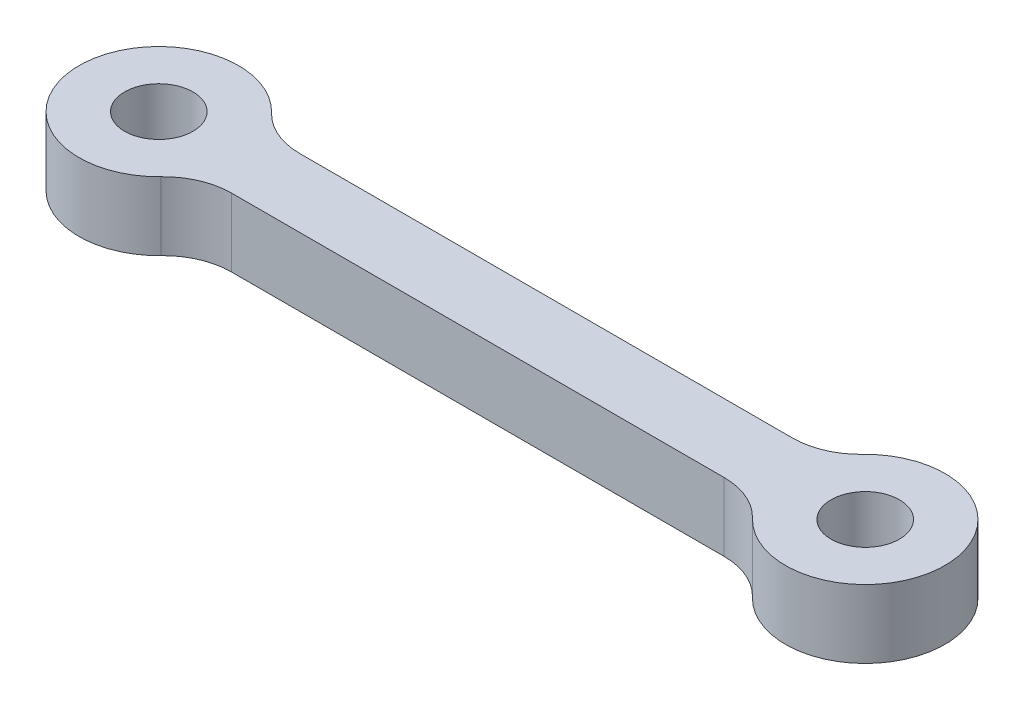
ISO-10303-21;
HEADER;
FILE_DESCRIPTION(('STEP AP214'),'2;1');
FILE_NAME('part.step','',(''),(''),'','','');
FILE_SCHEMA(('AUTOMOTIVE_DESIGN { 1 0 10303 214 1 1 1 1 }'));
ENDSEC;
DATA;
#1=APPLICATION_CONTEXT('core data for automotive mechanical design processes');
#2=APPLICATION_PROTOCOL_DEFINITION('international standard','automotive_design',2000,#1);
#3=PRODUCT_CONTEXT('',#1,'mechanical');
#4=PRODUCT('Part','Part','',(#3));
#5=PRODUCT_RELATED_PRODUCT_CATEGORY('part','',(#4));
#6=PRODUCT_DEFINITION_FORMATION('','',#4);
#7=PRODUCT_DEFINITION_CONTEXT('part definition',#1,'design');
#8=PRODUCT_DEFINITION('design','',#6,#7);
#9=PRODUCT_DEFINITION_SHAPE('','',#8);
#10=(LENGTH_UNIT() NAMED_UNIT(*) SI_UNIT(.MILLI.,.METRE.));
#11=(NAMED_UNIT(*) PLANE_ANGLE_UNIT() SI_UNIT($,.RADIAN.));
#12=(NAMED_UNIT(*) SI_UNIT($,.STERADIAN.) SOLID_ANGLE_UNIT());
#13=UNCERTAINTY_MEASURE_WITH_UNIT(LENGTH_MEASURE(1.E-05),#10,'distance_accuracy_value','');
#14=(GEOMETRIC_REPRESENTATION_CONTEXT(3) GLOBAL_UNCERTAINTY_ASSIGNED_CONTEXT((#13)) GLOBAL_UNIT_ASSIGNED_CONTEXT((#10,
#11,#12)) REPRESENTATION_CONTEXT('',''));
#15=CARTESIAN_POINT('',(0.,0.,0.));
#16=DIRECTION('',(0.,0.,1.));
#17=DIRECTION('',(1.,0.,0.));
#18=AXIS2_PLACEMENT_3D('',#15,#16,#17);
#19=CARTESIAN_POINT('',(29.2777777777778,2.83333333333333,0.));
#20=DIRECTION('',(0.,-1.,0.));
#21=DIRECTION('',(0.,0.,-1.));
#22=AXIS2_PLACEMENT_3D('',#19,#20,#21);
#23=CYLINDRICAL_SURFACE('',#22,3.11111111111111);
#24=CARTESIAN_POINT('',(29.2777777777778,2.83333333333333,0.));
#25=DIRECTION('',(0.,1.,0.));
#26=DIRECTION('',(0.,0.,1.));
#27=AXIS2_PLACEMENT_3D('',#24,#25,#26);
#28=CIRCLE('',#27,3.11111111111111);
#29=CARTESIAN_POINT('',(27.0327924568366,2.83333333333333,2.15384615384615));
#30=VERTEX_POINT('',#29);
#31=CARTESIAN_POINT('',(27.0327924568367,2.83333333333333,-2.15384615384616));
#32=VERTEX_POINT('',#31);
#33=EDGE_CURVE('E146',#30,#32,#28,.T.);
#34=ORIENTED_EDGE('',*,*,#33,.F.);
#35=DIRECTION('',(0.,-1.,0.));
#36=VECTOR('',#35,1.);
#37=CARTESIAN_POINT('',(27.0327924568366,2.83333333333333,2.15384615384615));
#38=LINE('',#37,#36);
#39=CARTESIAN_POINT('',(27.0327924568366,0.166666666666667,2.15384615384615));
#40=VERTEX_POINT('',#39);
#41=EDGE_CURVE('E154',#30,#40,#38,.T.);
#42=ORIENTED_EDGE('',*,*,#41,.T.);
#43=CARTESIAN_POINT('',(29.2777777777778,0.166666666666667,0.));
#44=DIRECTION('',(0.,1.,0.));
#45=DIRECTION('',(0.,0.,1.));
#46=AXIS2_PLACEMENT_3D('',#43,#44,#45);
#47=CIRCLE('',#46,3.11111111111111);
#48=CARTESIAN_POINT('',(27.0327924568367,0.166666666666667,-2.15384615384616));
#49=VERTEX_POINT('',#48);
#50=EDGE_CURVE('E171',#40,#49,#47,.T.);
#51=ORIENTED_EDGE('',*,*,#50,.T.);
#52=DIRECTION('',(0.,-1.,0.));
#53=VECTOR('',#52,1.);
#54=CARTESIAN_POINT('',(27.0327924568367,2.83333333333333,-2.15384615384615));
#55=LINE('',#54,#53);
#56=EDGE_CURVE('E152',#49,#32,#55,.F.);
#57=ORIENTED_EDGE('',*,*,#56,.T.);
#58=EDGE_LOOP('',(#34,#42,#51,#57));
#59=FACE_BOUND('',#58,.T.);
#60=ADVANCED_FACE('F40',(#59),#23,.T.);
#61=CARTESIAN_POINT('',(1.72222222222222,2.83333333333333,-1.33333333333333));
#62=DIRECTION('',(0.,0.,-1.));
#63=DIRECTION('',(-1.,0.,0.));
#64=AXIS2_PLACEMENT_3D('',#61,#62,#63);
#65=PLANE('',#64);
#66=DIRECTION('',(1.,0.,0.));
#67=VECTOR('',#66,1.);
#68=CARTESIAN_POINT('',(1.72222222222222,2.83333333333333,-1.33333333333333));
#69=LINE('',#68,#67);
#70=CARTESIAN_POINT('',(5.8914806753986,2.83333333333333,-1.33333333333333));
#71=VERTEX_POINT('',#70);
#72=CARTESIAN_POINT('',(25.1085193246014,2.83333333333333,-1.33333333333333));
#73=VERTEX_POINT('',#72);
#74=EDGE_CURVE('E178',#71,#73,#69,.T.);
#75=ORIENTED_EDGE('',*,*,#74,.T.);
#76=DIRECTION('',(0.,-1.,0.));
#77=VECTOR('',#76,1.);
#78=CARTESIAN_POINT('',(25.1085193246014,2.83333333333333,-1.33333333333333));
#79=LINE('',#78,#77);
#80=CARTESIAN_POINT('',(25.1085193246014,0.166666666666667,-1.33333333333333));
#81=VERTEX_POINT('',#80);
#82=EDGE_CURVE('E117',#73,#81,#79,.T.);
#83=ORIENTED_EDGE('',*,*,#82,.T.);
#84=DIRECTION('',(1.,0.,0.));
#85=VECTOR('',#84,1.);
#86=CARTESIAN_POINT('',(1.72222222222222,0.166666666666667,-1.33333333333333));
#87=LINE('',#86,#85);
#88=CARTESIAN_POINT('',(5.8914806753986,0.166666666666667,-1.33333333333333));
#89=VERTEX_POINT('',#88);
#90=EDGE_CURVE('E140',#89,#81,#87,.T.);
#91=ORIENTED_EDGE('',*,*,#90,.F.);
#92=DIRECTION('',(0.,-1.,0.));
#93=VECTOR('',#92,1.);
#94=CARTESIAN_POINT('',(5.8914806753986,2.83333333333333,-1.33333333333333));
#95=LINE('',#94,#93);
#96=EDGE_CURVE('E62',#89,#71,#95,.F.);
#97=ORIENTED_EDGE('',*,*,#96,.T.);
#98=EDGE_LOOP('',(#75,#83,#91,#97));
#99=FACE_BOUND('',#98,.T.);
#100=ADVANCED_FACE('F169',(#99),#65,.T.);
#101=CARTESIAN_POINT('',(1.72222222222222,2.83333333333333,0.));
#102=DIRECTION('',(0.,-1.,0.));
#103=DIRECTION('',(0.,0.,-1.));
#104=AXIS2_PLACEMENT_3D('',#101,#102,#103);
#105=CYLINDRICAL_SURFACE('',#104,3.11111111111111);
#106=CARTESIAN_POINT('',(1.72222222222222,0.166666666666667,0.));
#107=DIRECTION('',(0.,1.,0.));
#108=DIRECTION('',(0.,0.,1.));
#109=AXIS2_PLACEMENT_3D('',#106,#107,#108);
#110=CIRCLE('',#109,3.11111111111111);
#111=CARTESIAN_POINT('',(3.96720754316335,0.166666666666667,-2.15384615384615));
#112=VERTEX_POINT('',#111);
#113=CARTESIAN_POINT('',(3.96720754316335,0.166666666666667,2.15384615384615));
#114=VERTEX_POINT('',#113);
#115=EDGE_CURVE('E135',#112,#114,#110,.T.);
#116=ORIENTED_EDGE('',*,*,#115,.T.);
#117=DIRECTION('',(0.,-1.,0.));
#118=VECTOR('',#117,1.);
#119=CARTESIAN_POINT('',(3.96720754316335,2.83333333333333,2.15384615384615));
#120=LINE('',#119,#118);
#121=CARTESIAN_POINT('',(3.96720754316335,2.83333333333333,2.15384615384615));
#122=VERTEX_POINT('',#121);
#123=EDGE_CURVE('E111',#114,#122,#120,.F.);
#124=ORIENTED_EDGE('',*,*,#123,.T.);
#125=CARTESIAN_POINT('',(1.72222222222222,2.83333333333333,0.));
#126=DIRECTION('',(0.,1.,0.));
#127=DIRECTION('',(0.,0.,1.));
#128=AXIS2_PLACEMENT_3D('',#125,#126,#127);
#129=CIRCLE('',#128,3.11111111111111);
#130=CARTESIAN_POINT('',(3.96720754316335,2.83333333333333,-2.15384615384615));
#131=VERTEX_POINT('',#130);
#132=EDGE_CURVE('E177',#131,#122,#129,.T.);
#133=ORIENTED_EDGE('',*,*,#132,.F.);
#134=DIRECTION('',(0.,-1.,0.));
#135=VECTOR('',#134,1.);
#136=CARTESIAN_POINT('',(3.96720754316335,2.83333333333333,-2.15384615384615));
#137=LINE('',#136,#135);
#138=EDGE_CURVE('E127',#131,#112,#137,.T.);
#139=ORIENTED_EDGE('',*,*,#138,.T.);
#140=EDGE_LOOP('',(#116,#124,#133,#139));
#141=FACE_BOUND('',#140,.T.);
#142=ADVANCED_FACE('F180',(#141),#105,.T.);
#143=CARTESIAN_POINT('',(1.72222222222222,2.83333333333333,0.));
#144=DIRECTION('',(0.,-1.,0.));
#145=DIRECTION('',(0.,0.,-1.));
#146=AXIS2_PLACEMENT_3D('',#143,#144,#145);
#147=CYLINDRICAL_SURFACE('',#146,1.33333333333333);
#148=CARTESIAN_POINT('',(1.72222222222222,2.83333333333333,0.));
#149=DIRECTION('',(0.,1.,0.));
#150=DIRECTION('',(0.,0.,1.));
#151=AXIS2_PLACEMENT_3D('',#148,#149,#150);
#152=CIRCLE('',#151,1.33333333333333);
#153=CARTESIAN_POINT('',(1.72222222222222,2.83333333333333,1.33333333333333));
#154=VERTEX_POINT('',#153);
#155=EDGE_CURVE('E182',#154,#154,#152,.T.);
#156=ORIENTED_EDGE('',*,*,#155,.T.);
#157=EDGE_LOOP('',(#156));
#158=FACE_BOUND('',#157,.T.);
#159=CARTESIAN_POINT('',(1.72222222222222,0.166666666666667,0.));
#160=DIRECTION('',(0.,1.,0.));
#161=DIRECTION('',(0.,0.,1.));
#162=AXIS2_PLACEMENT_3D('',#159,#160,#161);
#163=CIRCLE('',#162,1.33333333333333);
#164=CARTESIAN_POINT('',(1.72222222222222,0.166666666666667,1.33333333333333));
#165=VERTEX_POINT('',#164);
#166=EDGE_CURVE('E134',#165,#165,#163,.T.);
#167=ORIENTED_EDGE('',*,*,#166,.F.);
#168=EDGE_LOOP('',(#167));
#169=FACE_BOUND('',#168,.T.);
#170=ADVANCED_FACE('F228',(#158,#169),#147,.F.);
#171=CARTESIAN_POINT('',(1.72222222222222,2.83333333333333,1.33333333333333));
#172=DIRECTION('',(0.,0.,-1.));
#173=DIRECTION('',(-1.,0.,0.));
#174=AXIS2_PLACEMENT_3D('',#171,#172,#173);
#175=PLANE('',#174);
#176=DIRECTION('',(1.,0.,0.));
#177=VECTOR('',#176,1.);
#178=CARTESIAN_POINT('',(1.72222222222222,2.83333333333333,1.33333333333333));
#179=LINE('',#178,#177);
#180=CARTESIAN_POINT('',(5.89148067539861,2.83333333333333,1.33333333333333));
#181=VERTEX_POINT('',#180);
#182=CARTESIAN_POINT('',(25.1085193246014,2.83333333333333,1.33333333333333));
#183=VERTEX_POINT('',#182);
#184=EDGE_CURVE('E126',#181,#183,#179,.T.);
#185=ORIENTED_EDGE('',*,*,#184,.F.);
#186=DIRECTION('',(0.,1.,0.));
#187=VECTOR('',#186,1.);
#188=CARTESIAN_POINT('',(5.89148067539861,0.166666666666667,1.33333333333333));
#189=LINE('',#188,#187);
#190=CARTESIAN_POINT('',(5.89148067539861,0.166666666666667,1.33333333333333));
#191=VERTEX_POINT('',#190);
#192=EDGE_CURVE('E110',#181,#191,#189,.F.);
#193=ORIENTED_EDGE('',*,*,#192,.T.);
#194=DIRECTION('',(1.,0.,0.));
#195=VECTOR('',#194,1.);
#196=CARTESIAN_POINT('',(1.72222222222222,0.166666666666667,1.33333333333333));
#197=LINE('',#196,#195);
#198=CARTESIAN_POINT('',(25.1085193246014,0.166666666666667,1.33333333333333));
#199=VERTEX_POINT('',#198);
#200=EDGE_CURVE('E123',#191,#199,#197,.T.);
#201=ORIENTED_EDGE('',*,*,#200,.T.);
#202=DIRECTION('',(0.,1.,0.));
#203=VECTOR('',#202,1.);
#204=CARTESIAN_POINT('',(25.1085193246014,2.83333333333333,1.33333333333333));
#205=LINE('',#204,#203);
#206=EDGE_CURVE('E128',#199,#183,#205,.T.);
#207=ORIENTED_EDGE('',*,*,#206,.T.);
#208=EDGE_LOOP('',(#185,#193,#201,#207));
#209=FACE_BOUND('',#208,.T.);
#210=ADVANCED_FACE('F122',(#209),#175,.F.);
#211=CARTESIAN_POINT('',(29.2777777777778,2.83333333333333,0.));
#212=DIRECTION('',(0.,-1.,0.));
#213=DIRECTION('',(0.,0.,-1.));
#214=AXIS2_PLACEMENT_3D('',#211,#212,#213);
#215=CYLINDRICAL_SURFACE('',#214,1.33333333333334);
#216=CARTESIAN_POINT('',(29.2777777777778,2.83333333333333,0.));
#217=DIRECTION('',(0.,1.,0.));
#218=DIRECTION('',(0.,0.,1.));
#219=AXIS2_PLACEMENT_3D('',#216,#217,#218);
#220=CIRCLE('',#219,1.33333333333334);
#221=CARTESIAN_POINT('',(29.2777777777778,2.83333333333333,1.33333333333334));
#222=VERTEX_POINT('',#221);
#223=EDGE_CURVE('E147',#222,#222,#220,.T.);
#224=ORIENTED_EDGE('',*,*,#223,.T.);
#225=EDGE_LOOP('',(#224));
#226=FACE_BOUND('',#225,.T.);
#227=CARTESIAN_POINT('',(29.2777777777778,0.166666666666667,0.));
#228=DIRECTION('',(0.,1.,0.));
#229=DIRECTION('',(0.,0.,1.));
#230=AXIS2_PLACEMENT_3D('',#227,#228,#229);
#231=CIRCLE('',#230,1.33333333333334);
#232=CARTESIAN_POINT('',(29.2777777777778,0.166666666666667,1.33333333333334));
#233=VERTEX_POINT('',#232);
#234=EDGE_CURVE('E138',#233,#233,#231,.T.);
#235=ORIENTED_EDGE('',*,*,#234,.F.);
#236=EDGE_LOOP('',(#235));
#237=FACE_BOUND('',#236,.T.);
#238=ADVANCED_FACE('F222',(#226,#237),#215,.F.);
#239=CARTESIAN_POINT('',(1.72222222222222,2.83333333333333,0.));
#240=DIRECTION('',(0.,1.,0.));
#241=DIRECTION('',(0.,0.,1.));
#242=AXIS2_PLACEMENT_3D('',#239,#240,#241);
#243=PLANE('',#242);
#244=ORIENTED_EDGE('',*,*,#184,.T.);
#245=CARTESIAN_POINT('',(25.1085193246014,2.83333333333333,4.));
#246=DIRECTION('',(0.,1.,0.));
#247=DIRECTION('',(0.,0.,1.));
#248=AXIS2_PLACEMENT_3D('',#245,#246,#247);
#249=CIRCLE('',#248,2.66666666666667);
#250=EDGE_CURVE('E162',#183,#30,#249,.F.);
#251=ORIENTED_EDGE('',*,*,#250,.T.);
#252=ORIENTED_EDGE('',*,*,#33,.T.);
#253=CARTESIAN_POINT('',(25.1085193246014,2.83333333333333,-4.));
#254=DIRECTION('',(0.,1.,0.));
#255=DIRECTION('',(0.,0.,1.));
#256=AXIS2_PLACEMENT_3D('',#253,#254,#255);
#257=CIRCLE('',#256,2.66666666666667);
#258=EDGE_CURVE('E55',#32,#73,#257,.F.);
#259=ORIENTED_EDGE('',*,*,#258,.T.);
#260=ORIENTED_EDGE('',*,*,#74,.F.);
#261=CARTESIAN_POINT('',(5.8914806753986,2.83333333333333,-4.));
#262=DIRECTION('',(0.,1.,0.));
#263=DIRECTION('',(0.,0.,1.));
#264=AXIS2_PLACEMENT_3D('',#261,#262,#263);
#265=CIRCLE('',#264,2.66666666666667);
#266=EDGE_CURVE('E11',#71,#131,#265,.F.);
#267=ORIENTED_EDGE('',*,*,#266,.T.);
#268=ORIENTED_EDGE('',*,*,#132,.T.);
#269=CARTESIAN_POINT('',(5.89148067539861,2.83333333333333,4.));
#270=DIRECTION('',(0.,1.,0.));
#271=DIRECTION('',(0.,0.,1.));
#272=AXIS2_PLACEMENT_3D('',#269,#270,#271);
#273=CIRCLE('',#272,2.66666666666667);
#274=EDGE_CURVE('E116',#122,#181,#273,.F.);
#275=ORIENTED_EDGE('',*,*,#274,.T.);
#276=EDGE_LOOP('',(#244,#251,#252,#259,#260,#267,#268,#275));
#277=FACE_BOUND('',#276,.T.);
#278=ORIENTED_EDGE('',*,*,#155,.F.);
#279=EDGE_LOOP('',(#278));
#280=FACE_BOUND('',#279,.T.);
#281=ORIENTED_EDGE('',*,*,#223,.F.);
#282=EDGE_LOOP('',(#281));
#283=FACE_BOUND('',#282,.T.);
#284=ADVANCED_FACE('F175',(#277,#280,#283),#243,.T.);
#285=CARTESIAN_POINT('',(1.72222222222222,0.166666666666667,0.));
#286=DIRECTION('',(0.,1.,0.));
#287=DIRECTION('',(0.,0.,1.));
#288=AXIS2_PLACEMENT_3D('',#285,#286,#287);
#289=PLANE('',#288);
#290=ORIENTED_EDGE('',*,*,#50,.F.);
#291=CARTESIAN_POINT('',(25.1085193246014,0.166666666666667,4.));
#292=DIRECTION('',(0.,1.,0.));
#293=DIRECTION('',(0.,0.,1.));
#294=AXIS2_PLACEMENT_3D('',#291,#292,#293);
#295=CIRCLE('',#294,2.66666666666667);
#296=EDGE_CURVE('E133',#40,#199,#295,.T.);
#297=ORIENTED_EDGE('',*,*,#296,.T.);
#298=ORIENTED_EDGE('',*,*,#200,.F.);
#299=CARTESIAN_POINT('',(5.89148067539861,0.166666666666667,4.));
#300=DIRECTION('',(0.,1.,0.));
#301=DIRECTION('',(0.,0.,1.));
#302=AXIS2_PLACEMENT_3D('',#299,#300,#301);
#303=CIRCLE('',#302,2.66666666666667);
#304=EDGE_CURVE('E106',#191,#114,#303,.T.);
#305=ORIENTED_EDGE('',*,*,#304,.T.);
#306=ORIENTED_EDGE('',*,*,#115,.F.);
#307=CARTESIAN_POINT('',(5.8914806753986,0.166666666666667,-4.));
#308=DIRECTION('',(0.,1.,0.));
#309=DIRECTION('',(0.,0.,1.));
#310=AXIS2_PLACEMENT_3D('',#307,#308,#309);
#311=CIRCLE('',#310,2.66666666666667);
#312=EDGE_CURVE('E48',#112,#89,#311,.T.);
#313=ORIENTED_EDGE('',*,*,#312,.T.);
#314=ORIENTED_EDGE('',*,*,#90,.T.);
#315=CARTESIAN_POINT('',(25.1085193246014,0.166666666666667,-4.));
#316=DIRECTION('',(0.,1.,0.));
#317=DIRECTION('',(0.,0.,1.));
#318=AXIS2_PLACEMENT_3D('',#315,#316,#317);
#319=CIRCLE('',#318,2.66666666666667);
#320=EDGE_CURVE('E164',#81,#49,#319,.T.);
#321=ORIENTED_EDGE('',*,*,#320,.T.);
#322=EDGE_LOOP('',(#290,#297,#298,#305,#306,#313,#314,#321));
#323=FACE_BOUND('',#322,.T.);
#324=ORIENTED_EDGE('',*,*,#166,.T.);
#325=EDGE_LOOP('',(#324));
#326=FACE_BOUND('',#325,.T.);
#327=ORIENTED_EDGE('',*,*,#234,.T.);
#328=EDGE_LOOP('',(#327));
#329=FACE_BOUND('',#328,.T.);
#330=ADVANCED_FACE('F131',(#323,#326,#329),#289,.F.);
#331=CARTESIAN_POINT('',(5.89148067539861,2.83333333333333,4.));
#332=DIRECTION('',(0.,-1.,0.));
#333=DIRECTION('',(0.,0.,-1.));
#334=AXIS2_PLACEMENT_3D('',#331,#332,#333);
#335=CYLINDRICAL_SURFACE('',#334,2.66666666666667);
#336=ORIENTED_EDGE('',*,*,#274,.F.);
#337=ORIENTED_EDGE('',*,*,#123,.F.);
#338=ORIENTED_EDGE('',*,*,#304,.F.);
#339=ORIENTED_EDGE('',*,*,#192,.F.);
#340=EDGE_LOOP('',(#336,#337,#338,#339));
#341=FACE_BOUND('',#340,.T.);
#342=ADVANCED_FACE('F109',(#341),#335,.F.);
#343=CARTESIAN_POINT('',(25.1085193246014,2.83333333333333,4.));
#344=DIRECTION('',(0.,-1.,0.));
#345=DIRECTION('',(0.,0.,-1.));
#346=AXIS2_PLACEMENT_3D('',#343,#344,#345);
#347=CYLINDRICAL_SURFACE('',#346,2.66666666666667);
#348=ORIENTED_EDGE('',*,*,#250,.F.);
#349=ORIENTED_EDGE('',*,*,#206,.F.);
#350=ORIENTED_EDGE('',*,*,#296,.F.);
#351=ORIENTED_EDGE('',*,*,#41,.F.);
#352=EDGE_LOOP('',(#348,#349,#350,#351));
#353=FACE_BOUND('',#352,.T.);
#354=ADVANCED_FACE('F199',(#353),#347,.F.);
#355=CARTESIAN_POINT('',(25.1085193246014,2.83333333333333,-4.));
#356=DIRECTION('',(0.,-1.,0.));
#357=DIRECTION('',(0.,0.,-1.));
#358=AXIS2_PLACEMENT_3D('',#355,#356,#357);
#359=CYLINDRICAL_SURFACE('',#358,2.66666666666667);
#360=ORIENTED_EDGE('',*,*,#258,.F.);
#361=ORIENTED_EDGE('',*,*,#56,.F.);
#362=ORIENTED_EDGE('',*,*,#320,.F.);
#363=ORIENTED_EDGE('',*,*,#82,.F.);
#364=EDGE_LOOP('',(#360,#361,#362,#363));
#365=FACE_BOUND('',#364,.T.);
#366=ADVANCED_FACE('F197',(#365),#359,.F.);
#367=CARTESIAN_POINT('',(5.8914806753986,2.83333333333333,-4.));
#368=DIRECTION('',(0.,-1.,0.));
#369=DIRECTION('',(0.,0.,-1.));
#370=AXIS2_PLACEMENT_3D('',#367,#368,#369);
#371=CYLINDRICAL_SURFACE('',#370,2.66666666666667);
#372=ORIENTED_EDGE('',*,*,#266,.F.);
#373=ORIENTED_EDGE('',*,*,#96,.F.);
#374=ORIENTED_EDGE('',*,*,#312,.F.);
#375=ORIENTED_EDGE('',*,*,#138,.F.);
#376=EDGE_LOOP('',(#372,#373,#374,#375));
#377=FACE_BOUND('',#376,.T.);
#378=ADVANCED_FACE('F42',(#377),#371,.F.);
#379=CLOSED_SHELL('',(#60,#100,#142,#170,#210,#238,#284,#330,#342,#354,#366,#378));
#380=MANIFOLD_SOLID_BREP('B2',#379);
#381=ADVANCED_BREP_SHAPE_REPRESENTATION('',(#18,#380),#14);
#382=SHAPE_DEFINITION_REPRESENTATION(#9,#381);
ENDSEC;
END-ISO-10303-21;
